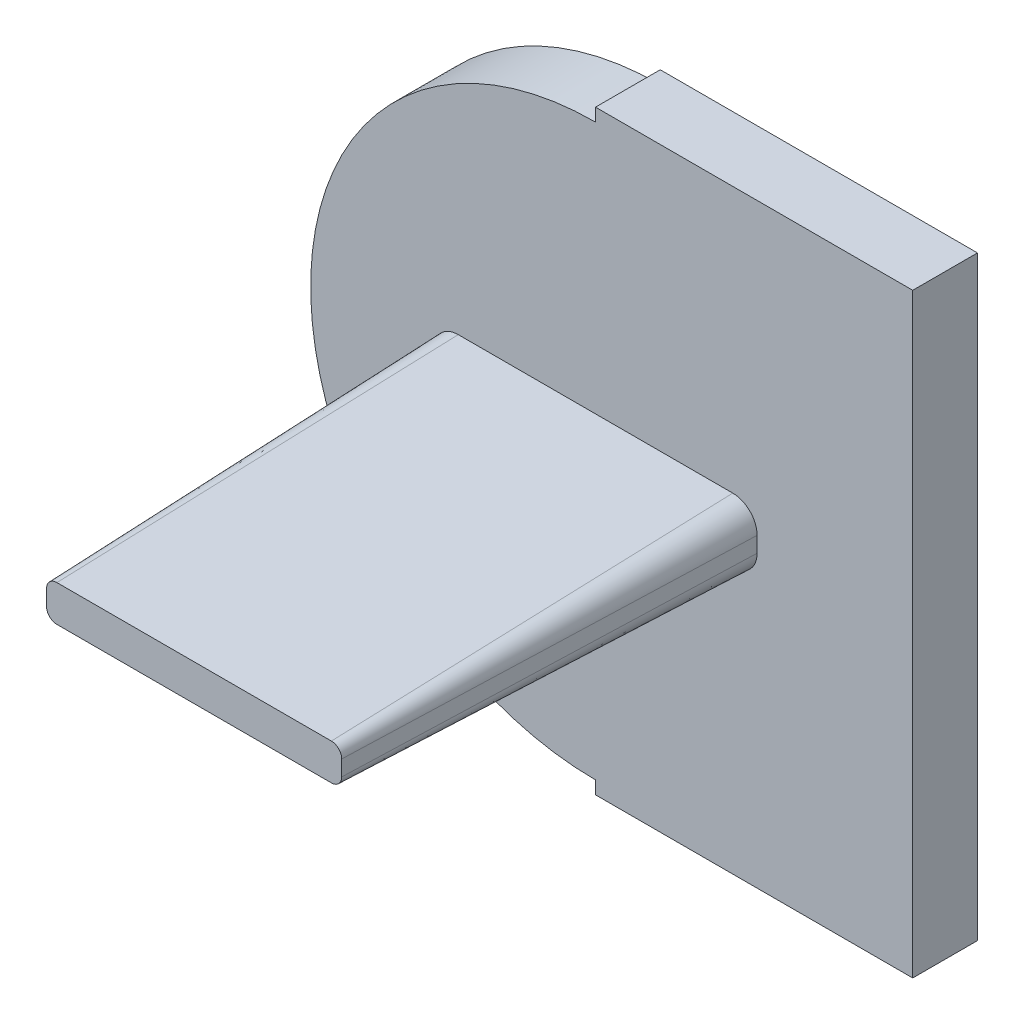
ISO-10303-21;
HEADER;
FILE_DESCRIPTION(('STEP AP214'),'2;1');
FILE_NAME('part.step','',(''),(''),'','','');
FILE_SCHEMA(('AUTOMOTIVE_DESIGN { 1 0 10303 214 1 1 1 1 }'));
ENDSEC;
DATA;
#1=APPLICATION_CONTEXT('core data for automotive mechanical design processes');
#2=APPLICATION_PROTOCOL_DEFINITION('international standard','automotive_design',2000,#1);
#3=PRODUCT_CONTEXT('',#1,'mechanical');
#4=PRODUCT('Part','Part','',(#3));
#5=PRODUCT_RELATED_PRODUCT_CATEGORY('part','',(#4));
#6=PRODUCT_DEFINITION_FORMATION('','',#4);
#7=PRODUCT_DEFINITION_CONTEXT('part definition',#1,'design');
#8=PRODUCT_DEFINITION('design','',#6,#7);
#9=PRODUCT_DEFINITION_SHAPE('','',#8);
#10=(LENGTH_UNIT() NAMED_UNIT(*) SI_UNIT(.MILLI.,.METRE.));
#11=(NAMED_UNIT(*) PLANE_ANGLE_UNIT() SI_UNIT($,.RADIAN.));
#12=(NAMED_UNIT(*) SI_UNIT($,.STERADIAN.) SOLID_ANGLE_UNIT());
#13=UNCERTAINTY_MEASURE_WITH_UNIT(LENGTH_MEASURE(1.E-05),#10,'distance_accuracy_value','');
#14=(GEOMETRIC_REPRESENTATION_CONTEXT(3) GLOBAL_UNCERTAINTY_ASSIGNED_CONTEXT((#13)) GLOBAL_UNIT_ASSIGNED_CONTEXT((#10,
#11,#12)) REPRESENTATION_CONTEXT('',''));
#15=CARTESIAN_POINT('',(0.,0.,0.));
#16=DIRECTION('',(0.,0.,1.));
#17=DIRECTION('',(1.,0.,0.));
#18=AXIS2_PLACEMENT_3D('',#15,#16,#17);
#19=CARTESIAN_POINT('',(-2.85003045864904,0.,7.74825502516488));
#20=DIRECTION('',(-0.999390827019096,0.,0.0348994967025009));
#21=DIRECTION('',(0.0348994967025009,0.,0.999390827019096));
#22=AXIS2_PLACEMENT_3D('',#19,#20,#21);
#23=PLANE('',#22);
#24=DIRECTION('',(0.034899496702501,0.,0.999390827019096));
#25=VECTOR('',#24,1.);
#26=CARTESIAN_POINT('',(-17428.5845818685,0.149999999997866,-499000.));
#27=LINE('',#26,#25);
#28=CARTESIAN_POINT('',(-3.12060548634395,0.15,4.26323473051715E-11));
#29=VERTEX_POINT('',#28);
#30=CARTESIAN_POINT('',(-2.84996952278328,0.15,7.75000000003308));
#31=VERTEX_POINT('',#30);
#32=EDGE_CURVE('E121',#29,#31,#27,.T.);
#33=ORIENTED_EDGE('',*,*,#32,.F.);
#34=DIRECTION('',(0.,1.,0.));
#35=VECTOR('',#34,1.);
#36=CARTESIAN_POINT('',(-3.1206054863461,0.,0.));
#37=LINE('',#36,#35);
#38=CARTESIAN_POINT('',(-3.12060548634395,-0.15,4.26323473051715E-11));
#39=VERTEX_POINT('',#38);
#40=EDGE_CURVE('E115',#29,#39,#37,.F.);
#41=ORIENTED_EDGE('',*,*,#40,.T.);
#42=DIRECTION('',(0.034899496702501,0.,0.999390827019096));
#43=VECTOR('',#42,1.);
#44=CARTESIAN_POINT('',(-17428.5845818685,-0.150000000002134,-499000.));
#45=LINE('',#44,#43);
#46=CARTESIAN_POINT('',(-2.84996952278328,-0.15,7.75000000003308));
#47=VERTEX_POINT('',#46);
#48=EDGE_CURVE('E118',#47,#39,#45,.F.);
#49=ORIENTED_EDGE('',*,*,#48,.F.);
#50=DIRECTION('',(0.,1.,0.));
#51=VECTOR('',#50,1.);
#52=CARTESIAN_POINT('',(-2.84996952278505,0.,7.75));
#53=LINE('',#52,#51);
#54=EDGE_CURVE('E125',#47,#31,#53,.T.);
#55=ORIENTED_EDGE('',*,*,#54,.T.);
#56=EDGE_LOOP('',(#33,#41,#49,#55));
#57=FACE_BOUND('',#56,.T.);
#58=ADVANCED_FACE('F17',(#57),#23,.T.);
#59=CARTESIAN_POINT('',(2.85003045864904,0.,7.74825502516488));
#60=DIRECTION('',(0.999390827019096,0.,0.0348994967025009));
#61=DIRECTION('',(0.0348994967025009,0.,-0.999390827019096));
#62=AXIS2_PLACEMENT_3D('',#59,#60,#61);
#63=PLANE('',#62);
#64=DIRECTION('',(0.,1.,0.));
#65=VECTOR('',#64,1.);
#66=CARTESIAN_POINT('',(3.1206054863461,0.,0.));
#67=LINE('',#66,#65);
#68=CARTESIAN_POINT('',(3.12060548634631,-0.15,4.26323473051715E-11));
#69=VERTEX_POINT('',#68);
#70=CARTESIAN_POINT('',(3.12060548634631,0.15,4.26323473051715E-11));
#71=VERTEX_POINT('',#70);
#72=EDGE_CURVE('E124',#69,#71,#67,.T.);
#73=ORIENTED_EDGE('',*,*,#72,.T.);
#74=DIRECTION('',(-0.034899496702501,0.,0.999390827019096));
#75=VECTOR('',#74,1.);
#76=CARTESIAN_POINT('',(17428.5845818685,0.15,-499000.));
#77=LINE('',#76,#75);
#78=CARTESIAN_POINT('',(2.84996952278458,0.15,7.75000000003308));
#79=VERTEX_POINT('',#78);
#80=EDGE_CURVE('E157',#79,#71,#77,.F.);
#81=ORIENTED_EDGE('',*,*,#80,.F.);
#82=DIRECTION('',(0.,1.,0.));
#83=VECTOR('',#82,1.);
#84=CARTESIAN_POINT('',(2.84996952278506,0.,7.75));
#85=LINE('',#84,#83);
#86=CARTESIAN_POINT('',(2.84996952278547,-0.15,7.75000000000466));
#87=VERTEX_POINT('',#86);
#88=EDGE_CURVE('E164',#87,#79,#85,.T.);
#89=ORIENTED_EDGE('',*,*,#88,.F.);
#90=DIRECTION('',(-0.034899496702501,0.,0.999390827019096));
#91=VECTOR('',#90,1.);
#92=CARTESIAN_POINT('',(17428.5845818685,-0.15,-499000.));
#93=LINE('',#92,#91);
#94=EDGE_CURVE('E142',#69,#87,#93,.T.);
#95=ORIENTED_EDGE('',*,*,#94,.F.);
#96=EDGE_LOOP('',(#73,#81,#89,#95));
#97=FACE_BOUND('',#96,.T.);
#98=ADVANCED_FACE('F179',(#97),#63,.T.);
#99=CARTESIAN_POINT('',(-2.65,-0.15,1.70530256582424E-10));
#100=DIRECTION('',(0.,0.,-1.));
#101=DIRECTION('',(-1.,0.,0.));
#102=AXIS2_PLACEMENT_3D('',#99,#100,#101);
#103=CONICAL_SURFACE('',#102,0.470605486339218,0.0349065850397557);
#104=CARTESIAN_POINT('',(-2.65,-0.15,0.));
#105=DIRECTION('',(0.,0.,-1.));
#106=DIRECTION('',(-1.,0.,0.));
#107=AXIS2_PLACEMENT_3D('',#104,#105,#106);
#108=CIRCLE('',#107,0.470605486345173);
#109=CARTESIAN_POINT('',(-2.65,-0.620605486346104,0.));
#110=VERTEX_POINT('',#109);
#111=EDGE_CURVE('E20',#39,#110,#108,.F.);
#112=ORIENTED_EDGE('',*,*,#111,.T.);
#113=DIRECTION('',(0.,-0.0348994967025009,-0.999390827019096));
#114=VECTOR('',#113,1.);
#115=CARTESIAN_POINT('',(-2.65,-0.350030458649045,7.74825502516488));
#116=LINE('',#115,#114);
#117=CARTESIAN_POINT('',(-2.65,-0.349969522785281,7.74999999999363));
#118=VERTEX_POINT('',#117);
#119=EDGE_CURVE('E188',#118,#110,#116,.T.);
#120=ORIENTED_EDGE('',*,*,#119,.F.);
#121=CARTESIAN_POINT('',(-2.65,-0.15,7.74999999998727));
#122=DIRECTION('',(0.,0.,-1.));
#123=DIRECTION('',(-1.,0.,0.));
#124=AXIS2_PLACEMENT_3D('',#121,#122,#123);
#125=CIRCLE('',#124,0.199969522785589);
#126=EDGE_CURVE('E137',#47,#118,#125,.F.);
#127=ORIENTED_EDGE('',*,*,#126,.F.);
#128=ORIENTED_EDGE('',*,*,#48,.T.);
#129=EDGE_LOOP('',(#112,#120,#127,#128));
#130=FACE_BOUND('',#129,.T.);
#131=ADVANCED_FACE('F136',(#130),#103,.T.);
#132=CARTESIAN_POINT('',(2.65,-0.15,1.70530256582424E-10));
#133=DIRECTION('',(0.,0.,-1.));
#134=DIRECTION('',(-1.,0.,0.));
#135=AXIS2_PLACEMENT_3D('',#132,#133,#134);
#136=CONICAL_SURFACE('',#135,0.470605486341077,0.0349065850397557);
#137=CARTESIAN_POINT('',(2.65,-0.15,0.));
#138=DIRECTION('',(0.,0.,-1.));
#139=DIRECTION('',(-1.,0.,0.));
#140=AXIS2_PLACEMENT_3D('',#137,#138,#139);
#141=CIRCLE('',#140,0.470605486347032);
#142=CARTESIAN_POINT('',(2.65,-0.620605486346104,0.));
#143=VERTEX_POINT('',#142);
#144=EDGE_CURVE('E135',#143,#69,#141,.F.);
#145=ORIENTED_EDGE('',*,*,#144,.T.);
#146=ORIENTED_EDGE('',*,*,#94,.T.);
#147=CARTESIAN_POINT('',(2.65,-0.15,7.74999999998727));
#148=DIRECTION('',(0.,0.,-1.));
#149=DIRECTION('',(-1.,0.,0.));
#150=AXIS2_PLACEMENT_3D('',#147,#148,#149);
#151=CIRCLE('',#150,0.199969522787448);
#152=CARTESIAN_POINT('',(2.65,-0.349969522785281,7.74999999999363));
#153=VERTEX_POINT('',#152);
#154=EDGE_CURVE('E165',#153,#87,#151,.F.);
#155=ORIENTED_EDGE('',*,*,#154,.F.);
#156=DIRECTION('',(0.,-0.0348994967025009,-0.999390827019096));
#157=VECTOR('',#156,1.);
#158=CARTESIAN_POINT('',(2.65,-0.350030458649045,7.74825502516488));
#159=LINE('',#158,#157);
#160=EDGE_CURVE('E190',#143,#153,#159,.F.);
#161=ORIENTED_EDGE('',*,*,#160,.F.);
#162=EDGE_LOOP('',(#145,#146,#155,#161));
#163=FACE_BOUND('',#162,.T.);
#164=ADVANCED_FACE('F175',(#163),#136,.T.);
#165=CARTESIAN_POINT('',(-2.65,0.15,1.70530256582424E-10));
#166=DIRECTION('',(0.,0.,-1.));
#167=DIRECTION('',(-1.,0.,0.));
#168=AXIS2_PLACEMENT_3D('',#165,#166,#167);
#169=CONICAL_SURFACE('',#168,0.470605486339218,0.0349065850397557);
#170=CARTESIAN_POINT('',(-2.65,0.15,0.));
#171=DIRECTION('',(0.,0.,-1.));
#172=DIRECTION('',(-1.,0.,0.));
#173=AXIS2_PLACEMENT_3D('',#170,#171,#172);
#174=CIRCLE('',#173,0.470605486345173);
#175=CARTESIAN_POINT('',(-2.65,0.620605486346104,0.));
#176=VERTEX_POINT('',#175);
#177=EDGE_CURVE('E169',#176,#29,#174,.F.);
#178=ORIENTED_EDGE('',*,*,#177,.T.);
#179=ORIENTED_EDGE('',*,*,#32,.T.);
#180=CARTESIAN_POINT('',(-2.65,0.15,7.74999999998727));
#181=DIRECTION('',(0.,0.,-1.));
#182=DIRECTION('',(-1.,0.,0.));
#183=AXIS2_PLACEMENT_3D('',#180,#181,#182);
#184=CIRCLE('',#183,0.199969522785589);
#185=CARTESIAN_POINT('',(-2.65,0.349969522785281,7.74999999999363));
#186=VERTEX_POINT('',#185);
#187=EDGE_CURVE('E161',#186,#31,#184,.F.);
#188=ORIENTED_EDGE('',*,*,#187,.F.);
#189=DIRECTION('',(0.,-0.0348994967025009,0.999390827019096));
#190=VECTOR('',#189,1.);
#191=CARTESIAN_POINT('',(-2.65,0.350030458649045,7.74825502516488));
#192=LINE('',#191,#190);
#193=EDGE_CURVE('E192',#176,#186,#192,.T.);
#194=ORIENTED_EDGE('',*,*,#193,.F.);
#195=EDGE_LOOP('',(#178,#179,#188,#194));
#196=FACE_BOUND('',#195,.T.);
#197=ADVANCED_FACE('F203',(#196),#169,.T.);
#198=CARTESIAN_POINT('',(0.,0.,7.75));
#199=DIRECTION('',(0.,0.,1.));
#200=DIRECTION('',(1.,0.,0.));
#201=AXIS2_PLACEMENT_3D('',#198,#199,#200);
#202=PLANE('',#201);
#203=DIRECTION('',(1.,0.,0.));
#204=VECTOR('',#203,1.);
#205=CARTESIAN_POINT('',(0.,0.349969522785059,7.75));
#206=LINE('',#205,#204);
#207=CARTESIAN_POINT('',(2.65,0.349969522785281,7.74999999999363));
#208=VERTEX_POINT('',#207);
#209=EDGE_CURVE('E195',#186,#208,#206,.T.);
#210=ORIENTED_EDGE('',*,*,#209,.F.);
#211=ORIENTED_EDGE('',*,*,#187,.T.);
#212=ORIENTED_EDGE('',*,*,#54,.F.);
#213=ORIENTED_EDGE('',*,*,#126,.T.);
#214=DIRECTION('',(1.,0.,0.));
#215=VECTOR('',#214,1.);
#216=CARTESIAN_POINT('',(0.,-0.349969522785059,7.75));
#217=LINE('',#216,#215);
#218=EDGE_CURVE('E156',#153,#118,#217,.F.);
#219=ORIENTED_EDGE('',*,*,#218,.F.);
#220=ORIENTED_EDGE('',*,*,#154,.T.);
#221=ORIENTED_EDGE('',*,*,#88,.T.);
#222=CARTESIAN_POINT('',(2.65,0.15,7.74999999998727));
#223=DIRECTION('',(0.,0.,-1.));
#224=DIRECTION('',(-1.,0.,0.));
#225=AXIS2_PLACEMENT_3D('',#222,#223,#224);
#226=CIRCLE('',#225,0.199969522787448);
#227=EDGE_CURVE('E158',#208,#79,#226,.T.);
#228=ORIENTED_EDGE('',*,*,#227,.F.);
#229=EDGE_LOOP('',(#210,#211,#212,#213,#219,#220,#221,#228));
#230=FACE_BOUND('',#229,.T.);
#231=ADVANCED_FACE('F184',(#230),#202,.T.);
#232=CARTESIAN_POINT('',(2.65,0.15,1.70530256582424E-10));
#233=DIRECTION('',(0.,0.,-1.));
#234=DIRECTION('',(-1.,0.,0.));
#235=AXIS2_PLACEMENT_3D('',#232,#233,#234);
#236=CONICAL_SURFACE('',#235,0.470605486341077,0.0349065850397557);
#237=CARTESIAN_POINT('',(2.65,0.15,0.));
#238=DIRECTION('',(0.,0.,-1.));
#239=DIRECTION('',(-1.,0.,0.));
#240=AXIS2_PLACEMENT_3D('',#237,#238,#239);
#241=CIRCLE('',#240,0.470605486347032);
#242=CARTESIAN_POINT('',(2.65,0.620605486346104,0.));
#243=VERTEX_POINT('',#242);
#244=EDGE_CURVE('E154',#71,#243,#241,.F.);
#245=ORIENTED_EDGE('',*,*,#244,.T.);
#246=DIRECTION('',(0.,-0.0348994967025009,0.999390827019096));
#247=VECTOR('',#246,1.);
#248=CARTESIAN_POINT('',(2.65,0.350030458649045,7.74825502516488));
#249=LINE('',#248,#247);
#250=EDGE_CURVE('E200',#208,#243,#249,.F.);
#251=ORIENTED_EDGE('',*,*,#250,.F.);
#252=ORIENTED_EDGE('',*,*,#227,.T.);
#253=ORIENTED_EDGE('',*,*,#80,.T.);
#254=EDGE_LOOP('',(#245,#251,#252,#253));
#255=FACE_BOUND('',#254,.T.);
#256=ADVANCED_FACE('F375',(#255),#236,.T.);
#257=CARTESIAN_POINT('',(0.,-0.350030458649045,7.74825502516488));
#258=DIRECTION('',(0.,-0.999390827019096,0.0348994967025009));
#259=DIRECTION('',(0.,-0.0348994967025009,-0.999390827019096));
#260=AXIS2_PLACEMENT_3D('',#257,#258,#259);
#261=PLANE('',#260);
#262=DIRECTION('',(-1.,0.,0.));
#263=VECTOR('',#262,1.);
#264=CARTESIAN_POINT('',(0.,-0.620605486346104,0.));
#265=LINE('',#264,#263);
#266=EDGE_CURVE('E131',#110,#143,#265,.F.);
#267=ORIENTED_EDGE('',*,*,#266,.T.);
#268=ORIENTED_EDGE('',*,*,#160,.T.);
#269=ORIENTED_EDGE('',*,*,#218,.T.);
#270=ORIENTED_EDGE('',*,*,#119,.T.);
#271=EDGE_LOOP('',(#267,#268,#269,#270));
#272=FACE_BOUND('',#271,.T.);
#273=ADVANCED_FACE('F191',(#272),#261,.T.);
#274=CARTESIAN_POINT('',(0.,0.350030458649045,7.74825502516488));
#275=DIRECTION('',(0.,0.999390827019096,0.0348994967025009));
#276=DIRECTION('',(0.,-0.0348994967025009,0.999390827019096));
#277=AXIS2_PLACEMENT_3D('',#274,#275,#276);
#278=PLANE('',#277);
#279=ORIENTED_EDGE('',*,*,#250,.T.);
#280=DIRECTION('',(-1.,0.,0.));
#281=VECTOR('',#280,1.);
#282=CARTESIAN_POINT('',(0.,0.620605486346104,0.));
#283=LINE('',#282,#281);
#284=EDGE_CURVE('E211',#243,#176,#283,.T.);
#285=ORIENTED_EDGE('',*,*,#284,.T.);
#286=ORIENTED_EDGE('',*,*,#193,.T.);
#287=ORIENTED_EDGE('',*,*,#209,.T.);
#288=EDGE_LOOP('',(#279,#285,#286,#287));
#289=FACE_BOUND('',#288,.T.);
#290=ADVANCED_FACE('F209',(#289),#278,.T.);
#291=CARTESIAN_POINT('',(0.,0.,0.));
#292=DIRECTION('',(0.,0.,-1.));
#293=DIRECTION('',(-1.,0.,0.));
#294=AXIS2_PLACEMENT_3D('',#291,#292,#293);
#295=PLANE('',#294);
#296=DIRECTION('',(1.,0.,0.));
#297=VECTOR('',#296,1.);
#298=CARTESIAN_POINT('',(3.0625,-5.75,0.));
#299=LINE('',#298,#297);
#300=CARTESIAN_POINT('',(0.,-5.75,0.));
#301=VERTEX_POINT('',#300);
#302=CARTESIAN_POINT('',(6.125,-5.75,0.));
#303=VERTEX_POINT('',#302);
#304=EDGE_CURVE('E221',#301,#303,#299,.T.);
#305=ORIENTED_EDGE('',*,*,#304,.T.);
#306=DIRECTION('',(0.,-1.,0.));
#307=VECTOR('',#306,1.);
#308=CARTESIAN_POINT('',(6.125,0.,0.));
#309=LINE('',#308,#307);
#310=CARTESIAN_POINT('',(6.125,5.75,0.));
#311=VERTEX_POINT('',#310);
#312=EDGE_CURVE('E243',#303,#311,#309,.F.);
#313=ORIENTED_EDGE('',*,*,#312,.T.);
#314=DIRECTION('',(1.,0.,0.));
#315=VECTOR('',#314,1.);
#316=CARTESIAN_POINT('',(3.0625,5.75,0.));
#317=LINE('',#316,#315);
#318=CARTESIAN_POINT('',(0.,5.75,0.));
#319=VERTEX_POINT('',#318);
#320=EDGE_CURVE('E234',#311,#319,#317,.F.);
#321=ORIENTED_EDGE('',*,*,#320,.T.);
#322=DIRECTION('',(0.,1.,0.));
#323=VECTOR('',#322,1.);
#324=CARTESIAN_POINT('',(0.,5.625,0.));
#325=LINE('',#324,#323);
#326=CARTESIAN_POINT('',(0.,5.5,0.));
#327=VERTEX_POINT('',#326);
#328=EDGE_CURVE('E227',#319,#327,#325,.F.);
#329=ORIENTED_EDGE('',*,*,#328,.T.);
#330=CARTESIAN_POINT('',(0.,0.,0.));
#331=DIRECTION('',(0.,0.,1.));
#332=DIRECTION('',(1.,0.,0.));
#333=AXIS2_PLACEMENT_3D('',#330,#331,#332);
#334=CIRCLE('',#333,5.5);
#335=CARTESIAN_POINT('',(0.,-5.5,0.));
#336=VERTEX_POINT('',#335);
#337=EDGE_CURVE('E150',#336,#327,#334,.F.);
#338=ORIENTED_EDGE('',*,*,#337,.F.);
#339=DIRECTION('',(0.,1.,0.));
#340=VECTOR('',#339,1.);
#341=CARTESIAN_POINT('',(0.,-5.625,0.));
#342=LINE('',#341,#340);
#343=EDGE_CURVE('E153',#336,#301,#342,.F.);
#344=ORIENTED_EDGE('',*,*,#343,.T.);
#345=EDGE_LOOP('',(#305,#313,#321,#329,#338,#344));
#346=FACE_BOUND('',#345,.T.);
#347=ORIENTED_EDGE('',*,*,#40,.F.);
#348=ORIENTED_EDGE('',*,*,#177,.F.);
#349=ORIENTED_EDGE('',*,*,#284,.F.);
#350=ORIENTED_EDGE('',*,*,#244,.F.);
#351=ORIENTED_EDGE('',*,*,#72,.F.);
#352=ORIENTED_EDGE('',*,*,#144,.F.);
#353=ORIENTED_EDGE('',*,*,#266,.F.);
#354=ORIENTED_EDGE('',*,*,#111,.F.);
#355=EDGE_LOOP('',(#347,#348,#349,#350,#351,#352,#353,#354));
#356=FACE_BOUND('',#355,.T.);
#357=ADVANCED_FACE('F129',(#346,#356),#295,.F.);
#358=CARTESIAN_POINT('',(0.,-5.625,-1.25));
#359=DIRECTION('',(1.,0.,0.));
#360=DIRECTION('',(0.,1.,0.));
#361=AXIS2_PLACEMENT_3D('',#358,#359,#360);
#362=PLANE('',#361);
#363=DIRECTION('',(0.,0.,1.));
#364=VECTOR('',#363,1.);
#365=CARTESIAN_POINT('',(0.,-5.5,-1.25));
#366=LINE('',#365,#364);
#367=CARTESIAN_POINT('',(0.,-5.5,-1.25));
#368=VERTEX_POINT('',#367);
#369=EDGE_CURVE('E152',#368,#336,#366,.T.);
#370=ORIENTED_EDGE('',*,*,#369,.F.);
#371=DIRECTION('',(0.,1.,0.));
#372=VECTOR('',#371,1.);
#373=CARTESIAN_POINT('',(0.,0.,-1.25));
#374=LINE('',#373,#372);
#375=CARTESIAN_POINT('',(0.,-5.75,-1.25));
#376=VERTEX_POINT('',#375);
#377=EDGE_CURVE('E149',#376,#368,#374,.T.);
#378=ORIENTED_EDGE('',*,*,#377,.F.);
#379=DIRECTION('',(0.,0.,1.));
#380=VECTOR('',#379,1.);
#381=CARTESIAN_POINT('',(0.,-5.75,-1.25));
#382=LINE('',#381,#380);
#383=EDGE_CURVE('E224',#376,#301,#382,.T.);
#384=ORIENTED_EDGE('',*,*,#383,.T.);
#385=ORIENTED_EDGE('',*,*,#343,.F.);
#386=EDGE_LOOP('',(#370,#378,#384,#385));
#387=FACE_BOUND('',#386,.T.);
#388=ADVANCED_FACE('F282',(#387),#362,.F.);
#389=CARTESIAN_POINT('',(0.,0.,-1.25));
#390=DIRECTION('',(0.,0.,1.));
#391=DIRECTION('',(1.,0.,0.));
#392=AXIS2_PLACEMENT_3D('',#389,#390,#391);
#393=CYLINDRICAL_SURFACE('',#392,5.5);
#394=CARTESIAN_POINT('',(0.,0.,-1.25));
#395=DIRECTION('',(0.,0.,1.));
#396=DIRECTION('',(1.,0.,0.));
#397=AXIS2_PLACEMENT_3D('',#394,#395,#396);
#398=CIRCLE('',#397,5.5);
#399=CARTESIAN_POINT('',(0.,5.5,-1.25));
#400=VERTEX_POINT('',#399);
#401=EDGE_CURVE('E145',#368,#400,#398,.F.);
#402=ORIENTED_EDGE('',*,*,#401,.F.);
#403=ORIENTED_EDGE('',*,*,#369,.T.);
#404=ORIENTED_EDGE('',*,*,#337,.T.);
#405=DIRECTION('',(0.,0.,1.));
#406=VECTOR('',#405,1.);
#407=CARTESIAN_POINT('',(0.,5.5,-1.25));
#408=LINE('',#407,#406);
#409=EDGE_CURVE('E231',#327,#400,#408,.F.);
#410=ORIENTED_EDGE('',*,*,#409,.T.);
#411=EDGE_LOOP('',(#402,#403,#404,#410));
#412=FACE_BOUND('',#411,.T.);
#413=ADVANCED_FACE('F287',(#412),#393,.T.);
#414=CARTESIAN_POINT('',(0.,5.625,-1.25));
#415=DIRECTION('',(1.,0.,0.));
#416=DIRECTION('',(0.,1.,0.));
#417=AXIS2_PLACEMENT_3D('',#414,#415,#416);
#418=PLANE('',#417);
#419=DIRECTION('',(0.,0.,-1.));
#420=VECTOR('',#419,1.);
#421=CARTESIAN_POINT('',(0.,5.75,-1.25));
#422=LINE('',#421,#420);
#423=CARTESIAN_POINT('',(0.,5.75,-1.25));
#424=VERTEX_POINT('',#423);
#425=EDGE_CURVE('E230',#319,#424,#422,.T.);
#426=ORIENTED_EDGE('',*,*,#425,.T.);
#427=DIRECTION('',(0.,1.,0.));
#428=VECTOR('',#427,1.);
#429=CARTESIAN_POINT('',(0.,0.,-1.25));
#430=LINE('',#429,#428);
#431=EDGE_CURVE('E148',#400,#424,#430,.T.);
#432=ORIENTED_EDGE('',*,*,#431,.F.);
#433=ORIENTED_EDGE('',*,*,#409,.F.);
#434=ORIENTED_EDGE('',*,*,#328,.F.);
#435=EDGE_LOOP('',(#426,#432,#433,#434));
#436=FACE_BOUND('',#435,.T.);
#437=ADVANCED_FACE('F289',(#436),#418,.F.);
#438=CARTESIAN_POINT('',(3.0625,5.75,-1.25));
#439=DIRECTION('',(0.,-1.,0.));
#440=DIRECTION('',(0.,0.,-1.));
#441=AXIS2_PLACEMENT_3D('',#438,#439,#440);
#442=PLANE('',#441);
#443=DIRECTION('',(0.,0.,1.));
#444=VECTOR('',#443,1.);
#445=CARTESIAN_POINT('',(6.125,5.75,-1.25));
#446=LINE('',#445,#444);
#447=CARTESIAN_POINT('',(6.125,5.75,-1.25));
#448=VERTEX_POINT('',#447);
#449=EDGE_CURVE('E237',#311,#448,#446,.F.);
#450=ORIENTED_EDGE('',*,*,#449,.T.);
#451=DIRECTION('',(-1.,0.,0.));
#452=VECTOR('',#451,1.);
#453=CARTESIAN_POINT('',(0.3125,5.75,-1.25));
#454=LINE('',#453,#452);
#455=EDGE_CURVE('E270',#424,#448,#454,.F.);
#456=ORIENTED_EDGE('',*,*,#455,.F.);
#457=ORIENTED_EDGE('',*,*,#425,.F.);
#458=ORIENTED_EDGE('',*,*,#320,.F.);
#459=EDGE_LOOP('',(#450,#456,#457,#458));
#460=FACE_BOUND('',#459,.T.);
#461=ADVANCED_FACE('F291',(#460),#442,.F.);
#462=CARTESIAN_POINT('',(6.125,0.,-1.25));
#463=DIRECTION('',(-1.,0.,0.));
#464=DIRECTION('',(0.,-1.,0.));
#465=AXIS2_PLACEMENT_3D('',#462,#463,#464);
#466=PLANE('',#465);
#467=DIRECTION('',(0.,0.,1.));
#468=VECTOR('',#467,1.);
#469=CARTESIAN_POINT('',(6.125,-5.75,-1.25));
#470=LINE('',#469,#468);
#471=CARTESIAN_POINT('',(6.125,-5.75,-1.25));
#472=VERTEX_POINT('',#471);
#473=EDGE_CURVE('E35',#303,#472,#470,.F.);
#474=ORIENTED_EDGE('',*,*,#473,.T.);
#475=DIRECTION('',(0.,1.,0.));
#476=VECTOR('',#475,1.);
#477=CARTESIAN_POINT('',(6.125,0.,-1.25));
#478=LINE('',#477,#476);
#479=EDGE_CURVE('E26',#448,#472,#478,.F.);
#480=ORIENTED_EDGE('',*,*,#479,.F.);
#481=ORIENTED_EDGE('',*,*,#449,.F.);
#482=ORIENTED_EDGE('',*,*,#312,.F.);
#483=EDGE_LOOP('',(#474,#480,#481,#482));
#484=FACE_BOUND('',#483,.T.);
#485=ADVANCED_FACE('F298',(#484),#466,.F.);
#486=CARTESIAN_POINT('',(3.0625,-5.75,-1.25));
#487=DIRECTION('',(0.,1.,0.));
#488=DIRECTION('',(0.,0.,1.));
#489=AXIS2_PLACEMENT_3D('',#486,#487,#488);
#490=PLANE('',#489);
#491=ORIENTED_EDGE('',*,*,#383,.F.);
#492=DIRECTION('',(-1.,0.,0.));
#493=VECTOR('',#492,1.);
#494=CARTESIAN_POINT('',(0.3125,-5.75,-1.25));
#495=LINE('',#494,#493);
#496=EDGE_CURVE('E11',#472,#376,#495,.T.);
#497=ORIENTED_EDGE('',*,*,#496,.F.);
#498=ORIENTED_EDGE('',*,*,#473,.F.);
#499=ORIENTED_EDGE('',*,*,#304,.F.);
#500=EDGE_LOOP('',(#491,#497,#498,#499));
#501=FACE_BOUND('',#500,.T.);
#502=ADVANCED_FACE('F284',(#501),#490,.F.);
#503=CARTESIAN_POINT('',(0.3125,0.,-1.25));
#504=DIRECTION('',(0.,0.,-1.));
#505=DIRECTION('',(-1.,0.,0.));
#506=AXIS2_PLACEMENT_3D('',#503,#504,#505);
#507=PLANE('',#506);
#508=ORIENTED_EDGE('',*,*,#479,.T.);
#509=ORIENTED_EDGE('',*,*,#496,.T.);
#510=ORIENTED_EDGE('',*,*,#377,.T.);
#511=ORIENTED_EDGE('',*,*,#401,.T.);
#512=ORIENTED_EDGE('',*,*,#431,.T.);
#513=ORIENTED_EDGE('',*,*,#455,.T.);
#514=EDGE_LOOP('',(#508,#509,#510,#511,#512,#513));
#515=FACE_BOUND('',#514,.T.);
#516=ADVANCED_FACE('F280',(#515),#507,.T.);
#517=CLOSED_SHELL('',(#58,#98,#131,#164,#197,#231,#256,#273,#290,#357,#388,#413,#437,#461,#485,
#502,#516));
#518=MANIFOLD_SOLID_BREP('B1',#517);
#519=ADVANCED_BREP_SHAPE_REPRESENTATION('',(#18,#518),#14);
#520=SHAPE_DEFINITION_REPRESENTATION(#9,#519);
ENDSEC;
END-ISO-10303-21;
